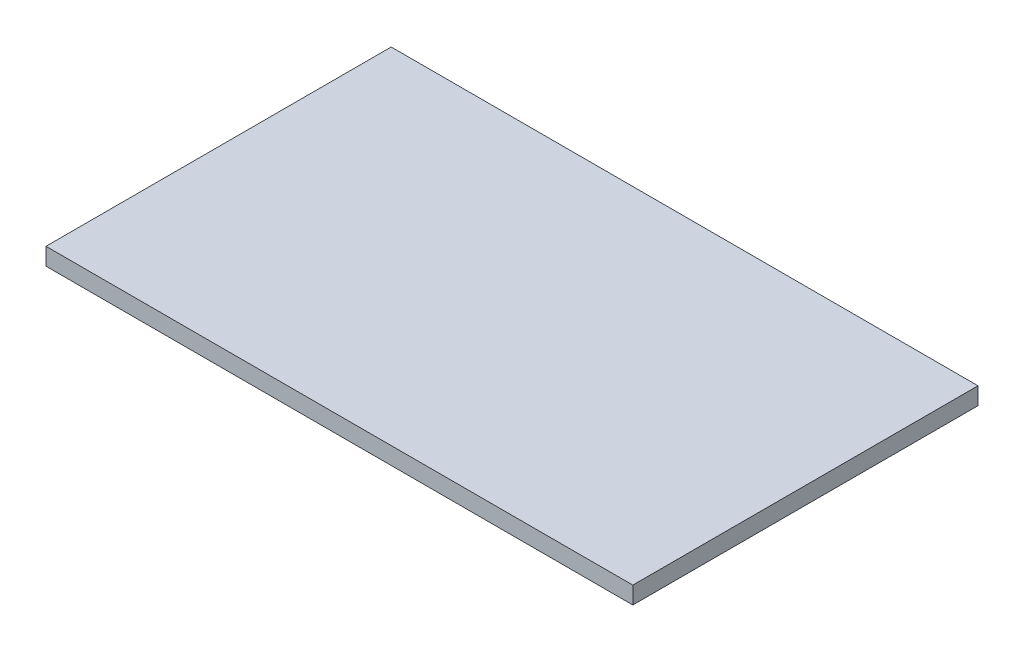
ISO-10303-21;
HEADER;
FILE_DESCRIPTION(('STEP AP214'),'2;1');
FILE_NAME('part.step','',(''),(''),'','','');
FILE_SCHEMA(('AUTOMOTIVE_DESIGN { 1 0 10303 214 1 1 1 1 }'));
ENDSEC;
DATA;
#1=APPLICATION_CONTEXT('core data for automotive mechanical design processes');
#2=APPLICATION_PROTOCOL_DEFINITION('international standard','automotive_design',2000,#1);
#3=PRODUCT_CONTEXT('',#1,'mechanical');
#4=PRODUCT('Part','Part','',(#3));
#5=PRODUCT_RELATED_PRODUCT_CATEGORY('part','',(#4));
#6=PRODUCT_DEFINITION_FORMATION('','',#4);
#7=PRODUCT_DEFINITION_CONTEXT('part definition',#1,'design');
#8=PRODUCT_DEFINITION('design','',#6,#7);
#9=PRODUCT_DEFINITION_SHAPE('','',#8);
#10=(LENGTH_UNIT() NAMED_UNIT(*) SI_UNIT(.MILLI.,.METRE.));
#11=(NAMED_UNIT(*) PLANE_ANGLE_UNIT() SI_UNIT($,.RADIAN.));
#12=(NAMED_UNIT(*) SI_UNIT($,.STERADIAN.) SOLID_ANGLE_UNIT());
#13=UNCERTAINTY_MEASURE_WITH_UNIT(LENGTH_MEASURE(1.E-05),#10,'distance_accuracy_value','');
#14=(GEOMETRIC_REPRESENTATION_CONTEXT(3) GLOBAL_UNCERTAINTY_ASSIGNED_CONTEXT((#13)) GLOBAL_UNIT_ASSIGNED_CONTEXT((#10,
#11,#12)) REPRESENTATION_CONTEXT('',''));
#15=CARTESIAN_POINT('',(0.,0.,0.));
#16=DIRECTION('',(0.,0.,1.));
#17=DIRECTION('',(1.,0.,0.));
#18=AXIS2_PLACEMENT_3D('',#15,#16,#17);
#19=CARTESIAN_POINT('',(431.8,12.7,-254.));
#20=DIRECTION('',(1.,0.,0.));
#21=DIRECTION('',(0.,0.,-1.));
#22=AXIS2_PLACEMENT_3D('',#19,#20,#21);
#23=PLANE('',#22);
#24=DIRECTION('',(0.,0.,1.));
#25=VECTOR('',#24,1.);
#26=CARTESIAN_POINT('',(431.8,0.,-254.));
#27=LINE('',#26,#25);
#28=CARTESIAN_POINT('',(431.8,0.,-254.));
#29=VERTEX_POINT('',#28);
#30=CARTESIAN_POINT('',(431.8,0.,0.));
#31=VERTEX_POINT('',#30);
#32=EDGE_CURVE('E97',#29,#31,#27,.T.);
#33=ORIENTED_EDGE('',*,*,#32,.F.);
#34=DIRECTION('',(0.,-1.,0.));
#35=VECTOR('',#34,1.);
#36=CARTESIAN_POINT('',(431.8,12.7,-254.));
#37=LINE('',#36,#35);
#38=CARTESIAN_POINT('',(431.8,12.7,-254.));
#39=VERTEX_POINT('',#38);
#40=EDGE_CURVE('E11',#39,#29,#37,.T.);
#41=ORIENTED_EDGE('',*,*,#40,.F.);
#42=DIRECTION('',(0.,0.,1.));
#43=VECTOR('',#42,1.);
#44=CARTESIAN_POINT('',(431.8,12.7,-254.));
#45=LINE('',#44,#43);
#46=CARTESIAN_POINT('',(431.8,12.7,0.));
#47=VERTEX_POINT('',#46);
#48=EDGE_CURVE('E91',#39,#47,#45,.T.);
#49=ORIENTED_EDGE('',*,*,#48,.T.);
#50=DIRECTION('',(0.,-1.,0.));
#51=VECTOR('',#50,1.);
#52=CARTESIAN_POINT('',(431.8,12.7,0.));
#53=LINE('',#52,#51);
#54=EDGE_CURVE('E36',#47,#31,#53,.T.);
#55=ORIENTED_EDGE('',*,*,#54,.T.);
#56=EDGE_LOOP('',(#33,#41,#49,#55));
#57=FACE_BOUND('',#56,.T.);
#58=ADVANCED_FACE('F33',(#57),#23,.T.);
#59=CARTESIAN_POINT('',(0.,12.7,-254.));
#60=DIRECTION('',(0.,0.,-1.));
#61=DIRECTION('',(-1.,0.,0.));
#62=AXIS2_PLACEMENT_3D('',#59,#60,#61);
#63=PLANE('',#62);
#64=DIRECTION('',(1.,0.,0.));
#65=VECTOR('',#64,1.);
#66=CARTESIAN_POINT('',(0.,0.,-254.));
#67=LINE('',#66,#65);
#68=CARTESIAN_POINT('',(0.,0.,-254.));
#69=VERTEX_POINT('',#68);
#70=EDGE_CURVE('E93',#69,#29,#67,.T.);
#71=ORIENTED_EDGE('',*,*,#70,.F.);
#72=DIRECTION('',(0.,-1.,0.));
#73=VECTOR('',#72,1.);
#74=CARTESIAN_POINT('',(0.,12.7,-254.));
#75=LINE('',#74,#73);
#76=CARTESIAN_POINT('',(0.,12.7,-254.));
#77=VERTEX_POINT('',#76);
#78=EDGE_CURVE('E42',#77,#69,#75,.T.);
#79=ORIENTED_EDGE('',*,*,#78,.F.);
#80=DIRECTION('',(1.,0.,0.));
#81=VECTOR('',#80,1.);
#82=CARTESIAN_POINT('',(0.,12.7,-254.));
#83=LINE('',#82,#81);
#84=EDGE_CURVE('E88',#77,#39,#83,.T.);
#85=ORIENTED_EDGE('',*,*,#84,.T.);
#86=ORIENTED_EDGE('',*,*,#40,.T.);
#87=EDGE_LOOP('',(#71,#79,#85,#86));
#88=FACE_BOUND('',#87,.T.);
#89=ADVANCED_FACE('F107',(#88),#63,.T.);
#90=CARTESIAN_POINT('',(0.,12.7,0.));
#91=DIRECTION('',(-1.,0.,0.));
#92=DIRECTION('',(0.,0.,1.));
#93=AXIS2_PLACEMENT_3D('',#90,#91,#92);
#94=PLANE('',#93);
#95=DIRECTION('',(0.,0.,-1.));
#96=VECTOR('',#95,1.);
#97=CARTESIAN_POINT('',(0.,0.,0.));
#98=LINE('',#97,#96);
#99=CARTESIAN_POINT('',(0.,0.,0.));
#100=VERTEX_POINT('',#99);
#101=EDGE_CURVE('E83',#100,#69,#98,.T.);
#102=ORIENTED_EDGE('',*,*,#101,.F.);
#103=DIRECTION('',(0.,-1.,0.));
#104=VECTOR('',#103,1.);
#105=CARTESIAN_POINT('',(0.,12.7,0.));
#106=LINE('',#105,#104);
#107=CARTESIAN_POINT('',(0.,12.7,0.));
#108=VERTEX_POINT('',#107);
#109=EDGE_CURVE('E78',#108,#100,#106,.T.);
#110=ORIENTED_EDGE('',*,*,#109,.F.);
#111=DIRECTION('',(0.,0.,-1.));
#112=VECTOR('',#111,1.);
#113=CARTESIAN_POINT('',(0.,12.7,0.));
#114=LINE('',#113,#112);
#115=EDGE_CURVE('E81',#108,#77,#114,.T.);
#116=ORIENTED_EDGE('',*,*,#115,.T.);
#117=ORIENTED_EDGE('',*,*,#78,.T.);
#118=EDGE_LOOP('',(#102,#110,#116,#117));
#119=FACE_BOUND('',#118,.T.);
#120=ADVANCED_FACE('F80',(#119),#94,.T.);
#121=CARTESIAN_POINT('',(431.8,12.7,0.));
#122=DIRECTION('',(0.,0.,1.));
#123=DIRECTION('',(1.,0.,0.));
#124=AXIS2_PLACEMENT_3D('',#121,#122,#123);
#125=PLANE('',#124);
#126=DIRECTION('',(-1.,0.,0.));
#127=VECTOR('',#126,1.);
#128=CARTESIAN_POINT('',(431.8,0.,0.));
#129=LINE('',#128,#127);
#130=EDGE_CURVE('E100',#31,#100,#129,.T.);
#131=ORIENTED_EDGE('',*,*,#130,.F.);
#132=ORIENTED_EDGE('',*,*,#54,.F.);
#133=DIRECTION('',(-1.,0.,0.));
#134=VECTOR('',#133,1.);
#135=CARTESIAN_POINT('',(431.8,12.7,0.));
#136=LINE('',#135,#134);
#137=EDGE_CURVE('E87',#47,#108,#136,.T.);
#138=ORIENTED_EDGE('',*,*,#137,.T.);
#139=ORIENTED_EDGE('',*,*,#109,.T.);
#140=EDGE_LOOP('',(#131,#132,#138,#139));
#141=FACE_BOUND('',#140,.T.);
#142=ADVANCED_FACE('F90',(#141),#125,.T.);
#143=CARTESIAN_POINT('',(0.,12.7,0.));
#144=DIRECTION('',(0.,-1.,0.));
#145=DIRECTION('',(0.,0.,-1.));
#146=AXIS2_PLACEMENT_3D('',#143,#144,#145);
#147=PLANE('',#146);
#148=ORIENTED_EDGE('',*,*,#48,.F.);
#149=ORIENTED_EDGE('',*,*,#84,.F.);
#150=ORIENTED_EDGE('',*,*,#115,.F.);
#151=ORIENTED_EDGE('',*,*,#137,.F.);
#152=EDGE_LOOP('',(#148,#149,#150,#151));
#153=FACE_BOUND('',#152,.T.);
#154=ADVANCED_FACE('F86',(#153),#147,.F.);
#155=CARTESIAN_POINT('',(0.,0.,0.));
#156=DIRECTION('',(0.,-1.,0.));
#157=DIRECTION('',(0.,0.,-1.));
#158=AXIS2_PLACEMENT_3D('',#155,#156,#157);
#159=PLANE('',#158);
#160=ORIENTED_EDGE('',*,*,#32,.T.);
#161=ORIENTED_EDGE('',*,*,#130,.T.);
#162=ORIENTED_EDGE('',*,*,#101,.T.);
#163=ORIENTED_EDGE('',*,*,#70,.T.);
#164=EDGE_LOOP('',(#160,#161,#162,#163));
#165=FACE_BOUND('',#164,.T.);
#166=ADVANCED_FACE('F106',(#165),#159,.T.);
#167=CLOSED_SHELL('',(#58,#89,#120,#142,#154,#166));
#168=MANIFOLD_SOLID_BREP('B2',#167);
#169=ADVANCED_BREP_SHAPE_REPRESENTATION('',(#18,#168),#14);
#170=SHAPE_DEFINITION_REPRESENTATION(#9,#169);
ENDSEC;
END-ISO-10303-21;
